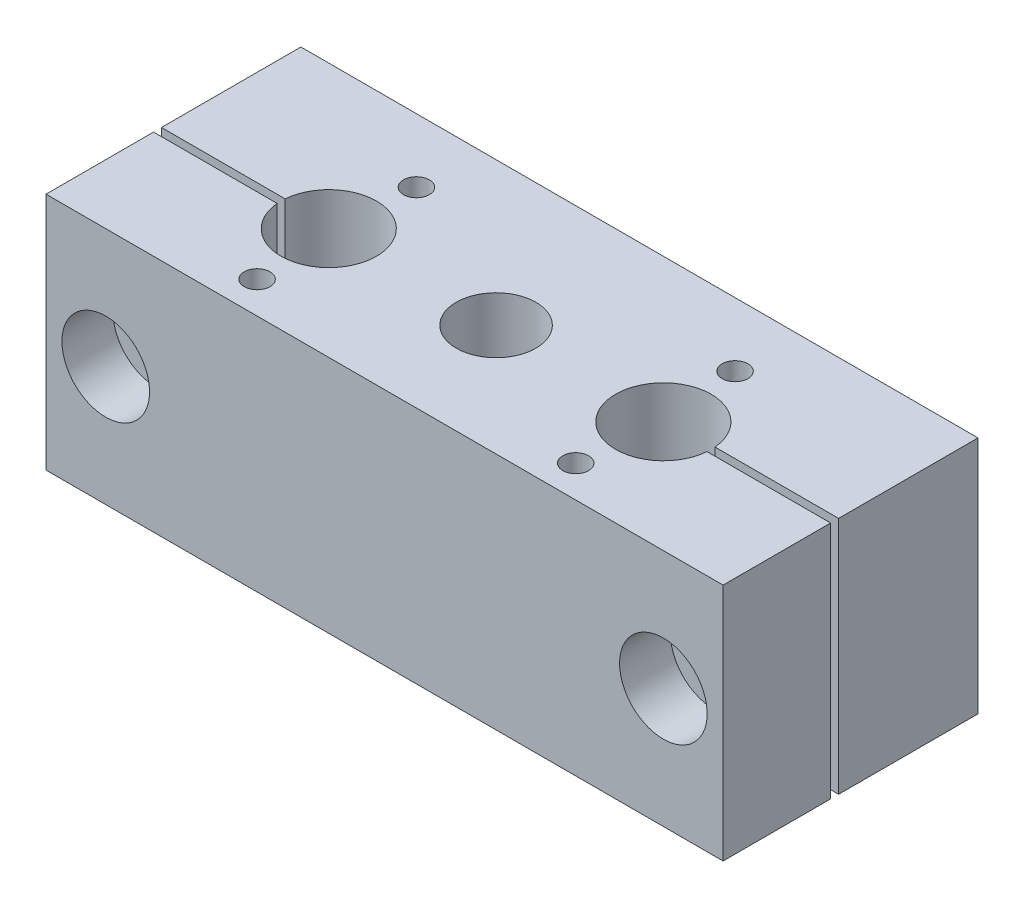
ISO-10303-21;
HEADER;
FILE_DESCRIPTION(('STEP AP214'),'2;1');
FILE_NAME('part.step','',(''),(''),'','','');
FILE_SCHEMA(('AUTOMOTIVE_DESIGN { 1 0 10303 214 1 1 1 1 }'));
ENDSEC;
DATA;
#1=APPLICATION_CONTEXT('core data for automotive mechanical design processes');
#2=APPLICATION_PROTOCOL_DEFINITION('international standard','automotive_design',2000,#1);
#3=PRODUCT_CONTEXT('',#1,'mechanical');
#4=PRODUCT('Part','Part','',(#3));
#5=PRODUCT_RELATED_PRODUCT_CATEGORY('part','',(#4));
#6=PRODUCT_DEFINITION_FORMATION('','',#4);
#7=PRODUCT_DEFINITION_CONTEXT('part definition',#1,'design');
#8=PRODUCT_DEFINITION('design','',#6,#7);
#9=PRODUCT_DEFINITION_SHAPE('','',#8);
#10=(LENGTH_UNIT() NAMED_UNIT(*) SI_UNIT(.MILLI.,.METRE.));
#11=(NAMED_UNIT(*) PLANE_ANGLE_UNIT() SI_UNIT($,.RADIAN.));
#12=(NAMED_UNIT(*) SI_UNIT($,.STERADIAN.) SOLID_ANGLE_UNIT());
#13=UNCERTAINTY_MEASURE_WITH_UNIT(LENGTH_MEASURE(1.E-05),#10,'distance_accuracy_value','');
#14=(GEOMETRIC_REPRESENTATION_CONTEXT(3) GLOBAL_UNCERTAINTY_ASSIGNED_CONTEXT((#13)) GLOBAL_UNIT_ASSIGNED_CONTEXT((#10,
#11,#12)) REPRESENTATION_CONTEXT('',''));
#15=CARTESIAN_POINT('',(0.,0.,0.));
#16=DIRECTION('',(0.,0.,1.));
#17=DIRECTION('',(1.,0.,0.));
#18=AXIS2_PLACEMENT_3D('',#15,#16,#17);
#19=CARTESIAN_POINT('',(-30.6,380.,25.6));
#20=DIRECTION('',(0.,0.,-1.));
#21=DIRECTION('',(-1.,0.,0.));
#22=AXIS2_PLACEMENT_3D('',#19,#20,#21);
#23=PLANE('',#22);
#24=CARTESIAN_POINT('',(-35.,380.,25.6));
#25=DIRECTION('',(0.,0.,-1.));
#26=DIRECTION('',(-1.,0.,0.));
#27=AXIS2_PLACEMENT_3D('',#24,#25,#26);
#28=CIRCLE('',#27,3.3);
#29=CARTESIAN_POINT('',(-38.3,380.,25.6));
#30=VERTEX_POINT('',#29);
#31=EDGE_CURVE('E23',#30,#30,#28,.T.);
#32=ORIENTED_EDGE('',*,*,#31,.T.);
#33=EDGE_LOOP('',(#32));
#34=FACE_BOUND('',#33,.T.);
#35=CARTESIAN_POINT('',(-35.,380.,25.6));
#36=DIRECTION('',(0.,0.,-1.));
#37=DIRECTION('',(-1.,0.,0.));
#38=AXIS2_PLACEMENT_3D('',#35,#36,#37);
#39=CIRCLE('',#38,5.5);
#40=CARTESIAN_POINT('',(-40.5,380.,25.6));
#41=VERTEX_POINT('',#40);
#42=EDGE_CURVE('E418',#41,#41,#39,.F.);
#43=ORIENTED_EDGE('',*,*,#42,.T.);
#44=EDGE_LOOP('',(#43));
#45=FACE_BOUND('',#44,.T.);
#46=ADVANCED_FACE('F19',(#34,#45),#23,.F.);
#47=CARTESIAN_POINT('',(39.4,380.,25.6));
#48=DIRECTION('',(0.,0.,-1.));
#49=DIRECTION('',(-1.,0.,0.));
#50=AXIS2_PLACEMENT_3D('',#47,#48,#49);
#51=PLANE('',#50);
#52=CARTESIAN_POINT('',(35.,380.,25.6));
#53=DIRECTION('',(0.,0.,-1.));
#54=DIRECTION('',(-1.,0.,0.));
#55=AXIS2_PLACEMENT_3D('',#52,#53,#54);
#56=CIRCLE('',#55,3.3);
#57=CARTESIAN_POINT('',(31.7,380.,25.6));
#58=VERTEX_POINT('',#57);
#59=EDGE_CURVE('E412',#58,#58,#56,.T.);
#60=ORIENTED_EDGE('',*,*,#59,.T.);
#61=EDGE_LOOP('',(#60));
#62=FACE_BOUND('',#61,.T.);
#63=CARTESIAN_POINT('',(35.,380.,25.6));
#64=DIRECTION('',(0.,0.,-1.));
#65=DIRECTION('',(-1.,0.,0.));
#66=AXIS2_PLACEMENT_3D('',#63,#64,#65);
#67=CIRCLE('',#66,5.5);
#68=CARTESIAN_POINT('',(29.5,380.,25.6));
#69=VERTEX_POINT('',#68);
#70=EDGE_CURVE('E421',#69,#69,#67,.F.);
#71=ORIENTED_EDGE('',*,*,#70,.T.);
#72=EDGE_LOOP('',(#71));
#73=FACE_BOUND('',#72,.T.);
#74=ADVANCED_FACE('F678',(#62,#73),#51,.F.);
#75=CARTESIAN_POINT('',(20.,379.999999999995,28.));
#76=DIRECTION('',(0.,1.,0.));
#77=DIRECTION('',(0.,0.,1.));
#78=AXIS2_PLACEMENT_3D('',#75,#76,#77);
#79=CONICAL_SURFACE('',#78,1.61999999998443,1.04719755119735);
#80=CARTESIAN_POINT('',(20.,380.,28.));
#81=DIRECTION('',(0.,-1.,0.));
#82=DIRECTION('',(0.,0.,-1.));
#83=AXIS2_PLACEMENT_3D('',#80,#81,#82);
#84=CIRCLE('',#83,1.62);
#85=CARTESIAN_POINT('',(20.,380.,26.38));
#86=VERTEX_POINT('',#85);
#87=EDGE_CURVE('E531',#86,#86,#84,.F.);
#88=ORIENTED_EDGE('',*,*,#87,.T.);
#89=EDGE_LOOP('',(#88));
#90=FACE_BOUND('',#89,.T.);
#91=CARTESIAN_POINT('',(20.0000000000102,379.064692563929,28.));
#92=VERTEX_POINT('',#91);
#93=VERTEX_LOOP('',#92);
#94=FACE_BOUND('',#93,.T.);
#95=ADVANCED_FACE('F677',(#90,#94),#79,.F.);
#96=CARTESIAN_POINT('',(20.,379.999999999995,8.));
#97=DIRECTION('',(0.,1.,0.));
#98=DIRECTION('',(0.,0.,1.));
#99=AXIS2_PLACEMENT_3D('',#96,#97,#98);
#100=CONICAL_SURFACE('',#99,1.61999999998443,1.04719755119735);
#101=CARTESIAN_POINT('',(20.,380.,8.));
#102=DIRECTION('',(0.,-1.,0.));
#103=DIRECTION('',(0.,0.,-1.));
#104=AXIS2_PLACEMENT_3D('',#101,#102,#103);
#105=CIRCLE('',#104,1.62);
#106=CARTESIAN_POINT('',(20.,380.,6.38));
#107=VERTEX_POINT('',#106);
#108=EDGE_CURVE('E527',#107,#107,#105,.F.);
#109=ORIENTED_EDGE('',*,*,#108,.T.);
#110=EDGE_LOOP('',(#109));
#111=FACE_BOUND('',#110,.T.);
#112=CARTESIAN_POINT('',(20.0000000000102,379.064692563929,8.));
#113=VERTEX_POINT('',#112);
#114=VERTEX_LOOP('',#113);
#115=FACE_BOUND('',#114,.T.);
#116=ADVANCED_FACE('F674',(#111,#115),#100,.F.);
#117=CARTESIAN_POINT('',(-20.,379.999999999995,28.));
#118=DIRECTION('',(0.,1.,0.));
#119=DIRECTION('',(0.,0.,1.));
#120=AXIS2_PLACEMENT_3D('',#117,#118,#119);
#121=CONICAL_SURFACE('',#120,1.61999999996397,1.04719755119188);
#122=CARTESIAN_POINT('',(-20.,380.,28.));
#123=DIRECTION('',(0.,-1.,0.));
#124=DIRECTION('',(0.,0.,-1.));
#125=AXIS2_PLACEMENT_3D('',#122,#123,#124);
#126=CIRCLE('',#125,1.62);
#127=CARTESIAN_POINT('',(-20.,380.,26.38));
#128=VERTEX_POINT('',#127);
#129=EDGE_CURVE('E523',#128,#128,#126,.F.);
#130=ORIENTED_EDGE('',*,*,#129,.T.);
#131=EDGE_LOOP('',(#130));
#132=FACE_BOUND('',#131,.T.);
#133=CARTESIAN_POINT('',(-20.0000000000102,379.064692563929,28.));
#134=VERTEX_POINT('',#133);
#135=VERTEX_LOOP('',#134);
#136=FACE_BOUND('',#135,.T.);
#137=ADVANCED_FACE('F671',(#132,#136),#121,.F.);
#138=CARTESIAN_POINT('',(-20.,379.999999999995,8.));
#139=DIRECTION('',(0.,1.,0.));
#140=DIRECTION('',(0.,0.,1.));
#141=AXIS2_PLACEMENT_3D('',#138,#139,#140);
#142=CONICAL_SURFACE('',#141,1.61999999996397,1.04719755119188);
#143=CARTESIAN_POINT('',(-20.,380.,8.));
#144=DIRECTION('',(0.,-1.,0.));
#145=DIRECTION('',(0.,0.,-1.));
#146=AXIS2_PLACEMENT_3D('',#143,#144,#145);
#147=CIRCLE('',#146,1.62);
#148=CARTESIAN_POINT('',(-20.,380.,6.38));
#149=VERTEX_POINT('',#148);
#150=EDGE_CURVE('E520',#149,#149,#147,.F.);
#151=ORIENTED_EDGE('',*,*,#150,.T.);
#152=EDGE_LOOP('',(#151));
#153=FACE_BOUND('',#152,.T.);
#154=CARTESIAN_POINT('',(-20.0000000000102,379.064692563929,8.));
#155=VERTEX_POINT('',#154);
#156=VERTEX_LOOP('',#155);
#157=FACE_BOUND('',#156,.T.);
#158=ADVANCED_FACE('F668',(#153,#157),#142,.F.);
#159=CARTESIAN_POINT('',(-35.,380.,17.5000000000409));
#160=DIRECTION('',(0.,0.,1.));
#161=DIRECTION('',(1.,0.,0.));
#162=AXIS2_PLACEMENT_3D('',#159,#160,#161);
#163=CONICAL_SURFACE('',#162,4.00000000004411,0.785398163397448);
#164=CARTESIAN_POINT('',(-35.,380.,16.9));
#165=DIRECTION('',(0.,0.,1.));
#166=DIRECTION('',(1.,0.,0.));
#167=AXIS2_PLACEMENT_3D('',#164,#165,#166);
#168=CIRCLE('',#167,3.4);
#169=CARTESIAN_POINT('',(-31.6,380.,16.9));
#170=VERTEX_POINT('',#169);
#171=EDGE_CURVE('E534',#170,#170,#168,.F.);
#172=ORIENTED_EDGE('',*,*,#171,.T.);
#173=EDGE_LOOP('',(#172));
#174=FACE_BOUND('',#173,.T.);
#175=CARTESIAN_POINT('',(-35.,380.,17.5000000000409));
#176=DIRECTION('',(0.,0.,1.));
#177=DIRECTION('',(1.,0.,0.));
#178=AXIS2_PLACEMENT_3D('',#175,#176,#177);
#179=CIRCLE('',#178,4.00000000004411);
#180=CARTESIAN_POINT('',(-30.9999999999559,380.,17.5000000000409));
#181=VERTEX_POINT('',#180);
#182=EDGE_CURVE('E212',#181,#181,#179,.F.);
#183=ORIENTED_EDGE('',*,*,#182,.F.);
#184=EDGE_LOOP('',(#183));
#185=FACE_BOUND('',#184,.T.);
#186=ADVANCED_FACE('F437',(#174,#185),#163,.F.);
#187=CARTESIAN_POINT('',(-35.,380.,21.55));
#188=DIRECTION('',(0.,0.,-1.));
#189=DIRECTION('',(-1.,0.,0.));
#190=AXIS2_PLACEMENT_3D('',#187,#188,#189);
#191=CYLINDRICAL_SURFACE('',#190,3.3);
#192=ORIENTED_EDGE('',*,*,#31,.F.);
#193=EDGE_LOOP('',(#192));
#194=FACE_BOUND('',#193,.T.);
#195=CARTESIAN_POINT('',(-35.,380.,18.5));
#196=DIRECTION('',(0.,0.,-1.));
#197=DIRECTION('',(-1.,0.,0.));
#198=AXIS2_PLACEMENT_3D('',#195,#196,#197);
#199=CIRCLE('',#198,3.3);
#200=CARTESIAN_POINT('',(-38.3,380.,18.5));
#201=VERTEX_POINT('',#200);
#202=EDGE_CURVE('E177',#201,#201,#199,.T.);
#203=ORIENTED_EDGE('',*,*,#202,.T.);
#204=EDGE_LOOP('',(#203));
#205=FACE_BOUND('',#204,.T.);
#206=ADVANCED_FACE('F433',(#194,#205),#191,.F.);
#207=CARTESIAN_POINT('',(35.,380.,28.8));
#208=DIRECTION('',(0.,0.,-1.));
#209=DIRECTION('',(-1.,0.,0.));
#210=AXIS2_PLACEMENT_3D('',#207,#208,#209);
#211=CYLINDRICAL_SURFACE('',#210,5.5);
#212=CARTESIAN_POINT('',(35.,380.,32.));
#213=DIRECTION('',(0.,0.,-1.));
#214=DIRECTION('',(-1.,0.,0.));
#215=AXIS2_PLACEMENT_3D('',#212,#213,#214);
#216=CIRCLE('',#215,5.5);
#217=CARTESIAN_POINT('',(29.5,380.,32.));
#218=VERTEX_POINT('',#217);
#219=EDGE_CURVE('E330',#218,#218,#216,.T.);
#220=ORIENTED_EDGE('',*,*,#219,.F.);
#221=EDGE_LOOP('',(#220));
#222=FACE_BOUND('',#221,.T.);
#223=ORIENTED_EDGE('',*,*,#70,.F.);
#224=EDGE_LOOP('',(#223));
#225=FACE_BOUND('',#224,.T.);
#226=ADVANCED_FACE('F436',(#222,#225),#211,.F.);
#227=CARTESIAN_POINT('',(-35.,380.,28.8));
#228=DIRECTION('',(0.,0.,-1.));
#229=DIRECTION('',(-1.,0.,0.));
#230=AXIS2_PLACEMENT_3D('',#227,#228,#229);
#231=CYLINDRICAL_SURFACE('',#230,5.5);
#232=CARTESIAN_POINT('',(-35.,380.,32.));
#233=DIRECTION('',(0.,0.,-1.));
#234=DIRECTION('',(-1.,0.,0.));
#235=AXIS2_PLACEMENT_3D('',#232,#233,#234);
#236=CIRCLE('',#235,5.5);
#237=CARTESIAN_POINT('',(-40.5,380.,32.));
#238=VERTEX_POINT('',#237);
#239=EDGE_CURVE('E321',#238,#238,#236,.T.);
#240=ORIENTED_EDGE('',*,*,#239,.F.);
#241=EDGE_LOOP('',(#240));
#242=FACE_BOUND('',#241,.T.);
#243=ORIENTED_EDGE('',*,*,#42,.F.);
#244=EDGE_LOOP('',(#243));
#245=FACE_BOUND('',#244,.T.);
#246=ADVANCED_FACE('F662',(#242,#245),#231,.F.);
#247=CARTESIAN_POINT('',(35.,380.,21.55));
#248=DIRECTION('',(0.,0.,-1.));
#249=DIRECTION('',(-1.,0.,0.));
#250=AXIS2_PLACEMENT_3D('',#247,#248,#249);
#251=CYLINDRICAL_SURFACE('',#250,3.3);
#252=ORIENTED_EDGE('',*,*,#59,.F.);
#253=EDGE_LOOP('',(#252));
#254=FACE_BOUND('',#253,.T.);
#255=CARTESIAN_POINT('',(35.,380.,18.5));
#256=DIRECTION('',(0.,0.,-1.));
#257=DIRECTION('',(-1.,0.,0.));
#258=AXIS2_PLACEMENT_3D('',#255,#256,#257);
#259=CIRCLE('',#258,3.3);
#260=CARTESIAN_POINT('',(31.7,380.,18.5));
#261=VERTEX_POINT('',#260);
#262=EDGE_CURVE('E308',#261,#261,#259,.T.);
#263=ORIENTED_EDGE('',*,*,#262,.T.);
#264=EDGE_LOOP('',(#263));
#265=FACE_BOUND('',#264,.T.);
#266=ADVANCED_FACE('F567',(#254,#265),#251,.F.);
#267=CARTESIAN_POINT('',(35.,380.,17.4999999999272));
#268=DIRECTION('',(0.,0.,1.));
#269=DIRECTION('',(1.,0.,0.));
#270=AXIS2_PLACEMENT_3D('',#267,#268,#269);
#271=CONICAL_SURFACE('',#270,3.99999999999409,0.785398163444818);
#272=CARTESIAN_POINT('',(35.,380.,16.9));
#273=DIRECTION('',(0.,0.,1.));
#274=DIRECTION('',(1.,0.,0.));
#275=AXIS2_PLACEMENT_3D('',#272,#273,#274);
#276=CIRCLE('',#275,3.4);
#277=CARTESIAN_POINT('',(38.4,380.,16.9));
#278=VERTEX_POINT('',#277);
#279=EDGE_CURVE('E417',#278,#278,#276,.F.);
#280=ORIENTED_EDGE('',*,*,#279,.T.);
#281=EDGE_LOOP('',(#280));
#282=FACE_BOUND('',#281,.T.);
#283=CARTESIAN_POINT('',(35.,380.,17.4999999999522));
#284=DIRECTION('',(0.,0.,1.));
#285=DIRECTION('',(1.,0.,0.));
#286=AXIS2_PLACEMENT_3D('',#283,#284,#285);
#287=CIRCLE('',#286,4.0000000000191);
#288=CARTESIAN_POINT('',(39.0000000000191,380.,17.4999999999522));
#289=VERTEX_POINT('',#288);
#290=EDGE_CURVE('E358',#289,#289,#287,.F.);
#291=ORIENTED_EDGE('',*,*,#290,.F.);
#292=EDGE_LOOP('',(#291));
#293=FACE_BOUND('',#292,.T.);
#294=ADVANCED_FACE('F551',(#282,#293),#271,.F.);
#295=CARTESIAN_POINT('',(35.,380.,8.75));
#296=DIRECTION('',(0.,0.,1.));
#297=DIRECTION('',(1.,0.,0.));
#298=AXIS2_PLACEMENT_3D('',#295,#296,#297);
#299=CYLINDRICAL_SURFACE('',#298,3.4);
#300=CARTESIAN_POINT('',(35.,380.,0.600000000076761));
#301=DIRECTION('',(0.,0.,-1.));
#302=DIRECTION('',(-1.,0.,0.));
#303=AXIS2_PLACEMENT_3D('',#300,#301,#302);
#304=CIRCLE('',#303,3.39999999997417);
#305=CARTESIAN_POINT('',(31.6000000000258,380.,0.600000000076761));
#306=VERTEX_POINT('',#305);
#307=EDGE_CURVE('E481',#306,#306,#304,.T.);
#308=ORIENTED_EDGE('',*,*,#307,.T.);
#309=EDGE_LOOP('',(#308));
#310=FACE_BOUND('',#309,.T.);
#311=ORIENTED_EDGE('',*,*,#279,.F.);
#312=EDGE_LOOP('',(#311));
#313=FACE_BOUND('',#312,.T.);
#314=ADVANCED_FACE('F554',(#310,#313),#299,.F.);
#315=CARTESIAN_POINT('',(-35.,380.,8.75));
#316=DIRECTION('',(0.,0.,1.));
#317=DIRECTION('',(1.,0.,0.));
#318=AXIS2_PLACEMENT_3D('',#315,#316,#317);
#319=CYLINDRICAL_SURFACE('',#318,3.4);
#320=CARTESIAN_POINT('',(-35.,380.,0.599999999963075));
#321=DIRECTION('',(0.,0.,-1.));
#322=DIRECTION('',(-1.,0.,0.));
#323=AXIS2_PLACEMENT_3D('',#320,#321,#322);
#324=CIRCLE('',#323,3.40000000002419);
#325=CARTESIAN_POINT('',(-38.4000000000242,380.,0.599999999963075));
#326=VERTEX_POINT('',#325);
#327=EDGE_CURVE('E368',#326,#326,#324,.T.);
#328=ORIENTED_EDGE('',*,*,#327,.T.);
#329=EDGE_LOOP('',(#328));
#330=FACE_BOUND('',#329,.T.);
#331=ORIENTED_EDGE('',*,*,#171,.F.);
#332=EDGE_LOOP('',(#331));
#333=FACE_BOUND('',#332,.T.);
#334=ADVANCED_FACE('F556',(#330,#333),#319,.F.);
#335=CARTESIAN_POINT('',(20.,387.5,28.));
#336=DIRECTION('',(0.,-1.,0.));
#337=DIRECTION('',(0.,0.,-1.));
#338=AXIS2_PLACEMENT_3D('',#335,#336,#337);
#339=CYLINDRICAL_SURFACE('',#338,1.62);
#340=ORIENTED_EDGE('',*,*,#87,.F.);
#341=EDGE_LOOP('',(#340));
#342=FACE_BOUND('',#341,.T.);
#343=CARTESIAN_POINT('',(20.,395.,28.));
#344=DIRECTION('',(0.,-1.,0.));
#345=DIRECTION('',(0.,0.,-1.));
#346=AXIS2_PLACEMENT_3D('',#343,#344,#345);
#347=CIRCLE('',#346,1.62);
#348=CARTESIAN_POINT('',(20.,395.,26.38));
#349=VERTEX_POINT('',#348);
#350=EDGE_CURVE('E363',#349,#349,#347,.F.);
#351=ORIENTED_EDGE('',*,*,#350,.T.);
#352=EDGE_LOOP('',(#351));
#353=FACE_BOUND('',#352,.T.);
#354=ADVANCED_FACE('F564',(#342,#353),#339,.F.);
#355=CARTESIAN_POINT('',(20.,387.5,8.));
#356=DIRECTION('',(0.,-1.,0.));
#357=DIRECTION('',(0.,0.,-1.));
#358=AXIS2_PLACEMENT_3D('',#355,#356,#357);
#359=CYLINDRICAL_SURFACE('',#358,1.62);
#360=ORIENTED_EDGE('',*,*,#108,.F.);
#361=EDGE_LOOP('',(#360));
#362=FACE_BOUND('',#361,.T.);
#363=CARTESIAN_POINT('',(20.,395.,8.));
#364=DIRECTION('',(0.,-1.,0.));
#365=DIRECTION('',(0.,0.,-1.));
#366=AXIS2_PLACEMENT_3D('',#363,#364,#365);
#367=CIRCLE('',#366,1.62);
#368=CARTESIAN_POINT('',(20.,395.,6.38));
#369=VERTEX_POINT('',#368);
#370=EDGE_CURVE('E367',#369,#369,#367,.F.);
#371=ORIENTED_EDGE('',*,*,#370,.T.);
#372=EDGE_LOOP('',(#371));
#373=FACE_BOUND('',#372,.T.);
#374=ADVANCED_FACE('F642',(#362,#373),#359,.F.);
#375=CARTESIAN_POINT('',(-20.,387.5,28.));
#376=DIRECTION('',(0.,-1.,0.));
#377=DIRECTION('',(0.,0.,-1.));
#378=AXIS2_PLACEMENT_3D('',#375,#376,#377);
#379=CYLINDRICAL_SURFACE('',#378,1.62);
#380=ORIENTED_EDGE('',*,*,#129,.F.);
#381=EDGE_LOOP('',(#380));
#382=FACE_BOUND('',#381,.T.);
#383=CARTESIAN_POINT('',(-20.,395.,28.));
#384=DIRECTION('',(0.,-1.,0.));
#385=DIRECTION('',(0.,0.,-1.));
#386=AXIS2_PLACEMENT_3D('',#383,#384,#385);
#387=CIRCLE('',#386,1.62);
#388=CARTESIAN_POINT('',(-20.,395.,26.38));
#389=VERTEX_POINT('',#388);
#390=EDGE_CURVE('E372',#389,#389,#387,.F.);
#391=ORIENTED_EDGE('',*,*,#390,.T.);
#392=EDGE_LOOP('',(#391));
#393=FACE_BOUND('',#392,.T.);
#394=ADVANCED_FACE('F637',(#382,#393),#379,.F.);
#395=CARTESIAN_POINT('',(-20.,387.5,8.));
#396=DIRECTION('',(0.,-1.,0.));
#397=DIRECTION('',(0.,0.,-1.));
#398=AXIS2_PLACEMENT_3D('',#395,#396,#397);
#399=CYLINDRICAL_SURFACE('',#398,1.62);
#400=ORIENTED_EDGE('',*,*,#150,.F.);
#401=EDGE_LOOP('',(#400));
#402=FACE_BOUND('',#401,.T.);
#403=CARTESIAN_POINT('',(-20.,395.,8.));
#404=DIRECTION('',(0.,-1.,0.));
#405=DIRECTION('',(0.,0.,-1.));
#406=AXIS2_PLACEMENT_3D('',#403,#404,#405);
#407=CIRCLE('',#406,1.62);
#408=CARTESIAN_POINT('',(-20.,395.,6.38));
#409=VERTEX_POINT('',#408);
#410=EDGE_CURVE('E376',#409,#409,#407,.F.);
#411=ORIENTED_EDGE('',*,*,#410,.T.);
#412=EDGE_LOOP('',(#411));
#413=FACE_BOUND('',#412,.T.);
#414=ADVANCED_FACE('F632',(#402,#413),#399,.F.);
#415=CARTESIAN_POINT('',(0.,380.,18.));
#416=DIRECTION('',(0.,1.,0.));
#417=DIRECTION('',(0.,0.,1.));
#418=AXIS2_PLACEMENT_3D('',#415,#416,#417);
#419=CYLINDRICAL_SURFACE('',#418,5.);
#420=CARTESIAN_POINT('',(0.,395.,18.));
#421=DIRECTION('',(0.,1.,0.));
#422=DIRECTION('',(0.,0.,1.));
#423=AXIS2_PLACEMENT_3D('',#420,#421,#422);
#424=CIRCLE('',#423,5.);
#425=CARTESIAN_POINT('',(0.,395.,23.));
#426=VERTEX_POINT('',#425);
#427=EDGE_CURVE('E274',#426,#426,#424,.T.);
#428=ORIENTED_EDGE('',*,*,#427,.T.);
#429=EDGE_LOOP('',(#428));
#430=FACE_BOUND('',#429,.T.);
#431=CARTESIAN_POINT('',(0.,365.,18.));
#432=DIRECTION('',(0.,1.,0.));
#433=DIRECTION('',(0.,0.,1.));
#434=AXIS2_PLACEMENT_3D('',#431,#432,#433);
#435=CIRCLE('',#434,5.);
#436=CARTESIAN_POINT('',(0.,365.,23.));
#437=VERTEX_POINT('',#436);
#438=EDGE_CURVE('E252',#437,#437,#435,.F.);
#439=ORIENTED_EDGE('',*,*,#438,.T.);
#440=EDGE_LOOP('',(#439));
#441=FACE_BOUND('',#440,.T.);
#442=ADVANCED_FACE('F628',(#430,#441),#419,.F.);
#443=CARTESIAN_POINT('',(21.,380.,18.));
#444=DIRECTION('',(0.,-1.,0.));
#445=DIRECTION('',(0.,0.,-1.));
#446=AXIS2_PLACEMENT_3D('',#443,#444,#445);
#447=CYLINDRICAL_SURFACE('',#446,6.);
#448=CARTESIAN_POINT('',(21.,365.,18.));
#449=DIRECTION('',(0.,-1.,0.));
#450=DIRECTION('',(0.,0.,-1.));
#451=AXIS2_PLACEMENT_3D('',#448,#449,#450);
#452=CIRCLE('',#451,6.);
#453=CARTESIAN_POINT('',(26.9791303715507,365.,18.5));
#454=VERTEX_POINT('',#453);
#455=CARTESIAN_POINT('',(26.9791303715507,365.,17.5));
#456=VERTEX_POINT('',#455);
#457=EDGE_CURVE('E389',#454,#456,#452,.T.);
#458=ORIENTED_EDGE('',*,*,#457,.T.);
#459=DIRECTION('',(0.,1.,0.));
#460=VECTOR('',#459,1.);
#461=CARTESIAN_POINT('',(26.9791303715507,380.,17.5));
#462=LINE('',#461,#460);
#463=CARTESIAN_POINT('',(26.9791303715507,395.,17.5));
#464=VERTEX_POINT('',#463);
#465=EDGE_CURVE('E362',#464,#456,#462,.F.);
#466=ORIENTED_EDGE('',*,*,#465,.F.);
#467=CARTESIAN_POINT('',(21.,395.,18.));
#468=DIRECTION('',(0.,-1.,0.));
#469=DIRECTION('',(0.,0.,-1.));
#470=AXIS2_PLACEMENT_3D('',#467,#468,#469);
#471=CIRCLE('',#470,6.);
#472=CARTESIAN_POINT('',(26.9791303715507,395.,18.5));
#473=VERTEX_POINT('',#472);
#474=EDGE_CURVE('E238',#464,#473,#471,.F.);
#475=ORIENTED_EDGE('',*,*,#474,.T.);
#476=DIRECTION('',(0.,1.,0.));
#477=VECTOR('',#476,1.);
#478=CARTESIAN_POINT('',(26.9791303715507,380.,18.5));
#479=LINE('',#478,#477);
#480=EDGE_CURVE('E195',#473,#454,#479,.F.);
#481=ORIENTED_EDGE('',*,*,#480,.T.);
#482=EDGE_LOOP('',(#458,#466,#475,#481));
#483=FACE_BOUND('',#482,.T.);
#484=ADVANCED_FACE('F517',(#483),#447,.F.);
#485=CARTESIAN_POINT('',(-31.875,380.,17.5));
#486=DIRECTION('',(0.,0.,1.));
#487=DIRECTION('',(1.,0.,0.));
#488=AXIS2_PLACEMENT_3D('',#485,#486,#487);
#489=PLANE('',#488);
#490=DIRECTION('',(0.,1.,0.));
#491=VECTOR('',#490,1.);
#492=CARTESIAN_POINT('',(-42.5,380.,17.5));
#493=LINE('',#492,#491);
#494=CARTESIAN_POINT('',(-42.5,395.,17.5));
#495=VERTEX_POINT('',#494);
#496=CARTESIAN_POINT('',(-42.5,365.,17.5));
#497=VERTEX_POINT('',#496);
#498=EDGE_CURVE('E221',#495,#497,#493,.F.);
#499=ORIENTED_EDGE('',*,*,#498,.T.);
#500=DIRECTION('',(1.,0.,0.));
#501=VECTOR('',#500,1.);
#502=CARTESIAN_POINT('',(0.,365.,17.5));
#503=LINE('',#502,#501);
#504=CARTESIAN_POINT('',(-26.9791303715507,365.,17.5));
#505=VERTEX_POINT('',#504);
#506=EDGE_CURVE('E217',#497,#505,#503,.T.);
#507=ORIENTED_EDGE('',*,*,#506,.T.);
#508=DIRECTION('',(0.,-1.,0.));
#509=VECTOR('',#508,1.);
#510=CARTESIAN_POINT('',(-26.9791303715507,380.,17.5));
#511=LINE('',#510,#509);
#512=CARTESIAN_POINT('',(-26.9791303715507,395.,17.5));
#513=VERTEX_POINT('',#512);
#514=EDGE_CURVE('E148',#505,#513,#511,.F.);
#515=ORIENTED_EDGE('',*,*,#514,.T.);
#516=DIRECTION('',(1.,0.,0.));
#517=VECTOR('',#516,1.);
#518=CARTESIAN_POINT('',(0.,395.,17.5));
#519=LINE('',#518,#517);
#520=EDGE_CURVE('E164',#513,#495,#519,.F.);
#521=ORIENTED_EDGE('',*,*,#520,.T.);
#522=EDGE_LOOP('',(#499,#507,#515,#521));
#523=FACE_BOUND('',#522,.T.);
#524=ORIENTED_EDGE('',*,*,#182,.T.);
#525=EDGE_LOOP('',(#524));
#526=FACE_BOUND('',#525,.T.);
#527=ADVANCED_FACE('F243',(#523,#526),#489,.T.);
#528=CARTESIAN_POINT('',(-21.,380.,18.));
#529=DIRECTION('',(0.,-1.,0.));
#530=DIRECTION('',(0.,0.,-1.));
#531=AXIS2_PLACEMENT_3D('',#528,#529,#530);
#532=CYLINDRICAL_SURFACE('',#531,6.);
#533=CARTESIAN_POINT('',(-21.,365.,18.));
#534=DIRECTION('',(0.,-1.,0.));
#535=DIRECTION('',(0.,0.,-1.));
#536=AXIS2_PLACEMENT_3D('',#533,#534,#535);
#537=CIRCLE('',#536,6.);
#538=CARTESIAN_POINT('',(-26.9791303715507,365.,18.5));
#539=VERTEX_POINT('',#538);
#540=EDGE_CURVE('E171',#505,#539,#537,.T.);
#541=ORIENTED_EDGE('',*,*,#540,.T.);
#542=DIRECTION('',(0.,1.,0.));
#543=VECTOR('',#542,1.);
#544=CARTESIAN_POINT('',(-26.9791303715507,380.,18.5));
#545=LINE('',#544,#543);
#546=CARTESIAN_POINT('',(-26.9791303715507,395.,18.5));
#547=VERTEX_POINT('',#546);
#548=EDGE_CURVE('E169',#539,#547,#545,.T.);
#549=ORIENTED_EDGE('',*,*,#548,.T.);
#550=CARTESIAN_POINT('',(-21.,395.,18.));
#551=DIRECTION('',(0.,-1.,0.));
#552=DIRECTION('',(0.,0.,-1.));
#553=AXIS2_PLACEMENT_3D('',#550,#551,#552);
#554=CIRCLE('',#553,6.);
#555=EDGE_CURVE('E155',#547,#513,#554,.F.);
#556=ORIENTED_EDGE('',*,*,#555,.T.);
#557=ORIENTED_EDGE('',*,*,#514,.F.);
#558=EDGE_LOOP('',(#541,#549,#556,#557));
#559=FACE_BOUND('',#558,.T.);
#560=ADVANCED_FACE('F170',(#559),#532,.F.);
#561=CARTESIAN_POINT('',(-31.875,380.,18.5));
#562=DIRECTION('',(0.,0.,1.));
#563=DIRECTION('',(1.,0.,0.));
#564=AXIS2_PLACEMENT_3D('',#561,#562,#563);
#565=PLANE('',#564);
#566=DIRECTION('',(1.,0.,0.));
#567=VECTOR('',#566,1.);
#568=CARTESIAN_POINT('',(0.,365.,18.5));
#569=LINE('',#568,#567);
#570=CARTESIAN_POINT('',(-42.5,365.,18.5));
#571=VERTEX_POINT('',#570);
#572=EDGE_CURVE('E327',#539,#571,#569,.F.);
#573=ORIENTED_EDGE('',*,*,#572,.T.);
#574=DIRECTION('',(0.,1.,0.));
#575=VECTOR('',#574,1.);
#576=CARTESIAN_POINT('',(-42.5,380.,18.5));
#577=LINE('',#576,#575);
#578=CARTESIAN_POINT('',(-42.5,395.,18.5));
#579=VERTEX_POINT('',#578);
#580=EDGE_CURVE('E176',#571,#579,#577,.T.);
#581=ORIENTED_EDGE('',*,*,#580,.T.);
#582=DIRECTION('',(1.,0.,0.));
#583=VECTOR('',#582,1.);
#584=CARTESIAN_POINT('',(0.,395.,18.5));
#585=LINE('',#584,#583);
#586=EDGE_CURVE('E161',#579,#547,#585,.T.);
#587=ORIENTED_EDGE('',*,*,#586,.T.);
#588=ORIENTED_EDGE('',*,*,#548,.F.);
#589=EDGE_LOOP('',(#573,#581,#587,#588));
#590=FACE_BOUND('',#589,.T.);
#591=ORIENTED_EDGE('',*,*,#202,.F.);
#592=EDGE_LOOP('',(#591));
#593=FACE_BOUND('',#592,.T.);
#594=ADVANCED_FACE('F179',(#590,#593),#565,.F.);
#595=CARTESIAN_POINT('',(-42.5,380.,16.));
#596=DIRECTION('',(1.,0.,0.));
#597=DIRECTION('',(0.,0.,-1.));
#598=AXIS2_PLACEMENT_3D('',#595,#596,#597);
#599=PLANE('',#598);
#600=DIRECTION('',(0.,0.,1.));
#601=VECTOR('',#600,1.);
#602=CARTESIAN_POINT('',(-42.5,365.,16.));
#603=LINE('',#602,#601);
#604=CARTESIAN_POINT('',(-42.5,365.,32.));
#605=VERTEX_POINT('',#604);
#606=EDGE_CURVE('E324',#571,#605,#603,.T.);
#607=ORIENTED_EDGE('',*,*,#606,.T.);
#608=DIRECTION('',(0.,1.,0.));
#609=VECTOR('',#608,1.);
#610=CARTESIAN_POINT('',(-42.5,380.,32.));
#611=LINE('',#610,#609);
#612=CARTESIAN_POINT('',(-42.5,395.,32.));
#613=VERTEX_POINT('',#612);
#614=EDGE_CURVE('E309',#613,#605,#611,.F.);
#615=ORIENTED_EDGE('',*,*,#614,.F.);
#616=DIRECTION('',(0.,0.,-1.));
#617=VECTOR('',#616,1.);
#618=CARTESIAN_POINT('',(-42.5,395.,16.));
#619=LINE('',#618,#617);
#620=EDGE_CURVE('E182',#613,#579,#619,.T.);
#621=ORIENTED_EDGE('',*,*,#620,.T.);
#622=ORIENTED_EDGE('',*,*,#580,.F.);
#623=EDGE_LOOP('',(#607,#615,#621,#622));
#624=FACE_BOUND('',#623,.T.);
#625=ADVANCED_FACE('F511',(#624),#599,.F.);
#626=CARTESIAN_POINT('',(0.,380.,32.));
#627=DIRECTION('',(0.,0.,1.));
#628=DIRECTION('',(1.,0.,0.));
#629=AXIS2_PLACEMENT_3D('',#626,#627,#628);
#630=PLANE('',#629);
#631=ORIENTED_EDGE('',*,*,#614,.T.);
#632=DIRECTION('',(1.,0.,0.));
#633=VECTOR('',#632,1.);
#634=CARTESIAN_POINT('',(0.,365.,32.));
#635=LINE('',#634,#633);
#636=CARTESIAN_POINT('',(42.5,365.,32.));
#637=VERTEX_POINT('',#636);
#638=EDGE_CURVE('E302',#605,#637,#635,.T.);
#639=ORIENTED_EDGE('',*,*,#638,.T.);
#640=DIRECTION('',(0.,1.,0.));
#641=VECTOR('',#640,1.);
#642=CARTESIAN_POINT('',(42.5,380.,32.));
#643=LINE('',#642,#641);
#644=CARTESIAN_POINT('',(42.5,395.,32.));
#645=VERTEX_POINT('',#644);
#646=EDGE_CURVE('E305',#637,#645,#643,.T.);
#647=ORIENTED_EDGE('',*,*,#646,.T.);
#648=DIRECTION('',(1.,0.,0.));
#649=VECTOR('',#648,1.);
#650=CARTESIAN_POINT('',(0.,395.,32.));
#651=LINE('',#650,#649);
#652=EDGE_CURVE('E187',#645,#613,#651,.F.);
#653=ORIENTED_EDGE('',*,*,#652,.T.);
#654=EDGE_LOOP('',(#631,#639,#647,#653));
#655=FACE_BOUND('',#654,.T.);
#656=ORIENTED_EDGE('',*,*,#239,.T.);
#657=EDGE_LOOP('',(#656));
#658=FACE_BOUND('',#657,.T.);
#659=ORIENTED_EDGE('',*,*,#219,.T.);
#660=EDGE_LOOP('',(#659));
#661=FACE_BOUND('',#660,.T.);
#662=ADVANCED_FACE('F507',(#655,#658,#661),#630,.T.);
#663=CARTESIAN_POINT('',(42.5,380.,16.));
#664=DIRECTION('',(-1.,0.,0.));
#665=DIRECTION('',(0.,0.,1.));
#666=AXIS2_PLACEMENT_3D('',#663,#664,#665);
#667=PLANE('',#666);
#668=DIRECTION('',(0.,0.,-1.));
#669=VECTOR('',#668,1.);
#670=CARTESIAN_POINT('',(42.5,395.,16.));
#671=LINE('',#670,#669);
#672=CARTESIAN_POINT('',(42.5,395.,18.5));
#673=VERTEX_POINT('',#672);
#674=EDGE_CURVE('E270',#673,#645,#671,.F.);
#675=ORIENTED_EDGE('',*,*,#674,.T.);
#676=ORIENTED_EDGE('',*,*,#646,.F.);
#677=DIRECTION('',(0.,0.,1.));
#678=VECTOR('',#677,1.);
#679=CARTESIAN_POINT('',(42.5,365.,16.));
#680=LINE('',#679,#678);
#681=CARTESIAN_POINT('',(42.5,365.,18.5));
#682=VERTEX_POINT('',#681);
#683=EDGE_CURVE('E297',#637,#682,#680,.F.);
#684=ORIENTED_EDGE('',*,*,#683,.T.);
#685=DIRECTION('',(0.,1.,0.));
#686=VECTOR('',#685,1.);
#687=CARTESIAN_POINT('',(42.5,380.,18.5));
#688=LINE('',#687,#686);
#689=EDGE_CURVE('E296',#682,#673,#688,.T.);
#690=ORIENTED_EDGE('',*,*,#689,.T.);
#691=EDGE_LOOP('',(#675,#676,#684,#690));
#692=FACE_BOUND('',#691,.T.);
#693=ADVANCED_FACE('F503',(#692),#667,.F.);
#694=CARTESIAN_POINT('',(31.875,380.,18.5));
#695=DIRECTION('',(0.,0.,1.));
#696=DIRECTION('',(1.,0.,0.));
#697=AXIS2_PLACEMENT_3D('',#694,#695,#696);
#698=PLANE('',#697);
#699=DIRECTION('',(1.,0.,0.));
#700=VECTOR('',#699,1.);
#701=CARTESIAN_POINT('',(0.,395.,18.5));
#702=LINE('',#701,#700);
#703=EDGE_CURVE('E232',#473,#673,#702,.T.);
#704=ORIENTED_EDGE('',*,*,#703,.T.);
#705=ORIENTED_EDGE('',*,*,#689,.F.);
#706=DIRECTION('',(1.,0.,0.));
#707=VECTOR('',#706,1.);
#708=CARTESIAN_POINT('',(0.,365.,18.5));
#709=LINE('',#708,#707);
#710=EDGE_CURVE('E280',#682,#454,#709,.F.);
#711=ORIENTED_EDGE('',*,*,#710,.T.);
#712=ORIENTED_EDGE('',*,*,#480,.F.);
#713=EDGE_LOOP('',(#704,#705,#711,#712));
#714=FACE_BOUND('',#713,.T.);
#715=ORIENTED_EDGE('',*,*,#262,.F.);
#716=EDGE_LOOP('',(#715));
#717=FACE_BOUND('',#716,.T.);
#718=ADVANCED_FACE('F495',(#714,#717),#698,.F.);
#719=CARTESIAN_POINT('',(31.875,380.,17.5));
#720=DIRECTION('',(0.,0.,1.));
#721=DIRECTION('',(1.,0.,0.));
#722=AXIS2_PLACEMENT_3D('',#719,#720,#721);
#723=PLANE('',#722);
#724=DIRECTION('',(0.,1.,0.));
#725=VECTOR('',#724,1.);
#726=CARTESIAN_POINT('',(42.5,380.,17.5));
#727=LINE('',#726,#725);
#728=CARTESIAN_POINT('',(42.5,365.,17.5));
#729=VERTEX_POINT('',#728);
#730=CARTESIAN_POINT('',(42.5,395.,17.5));
#731=VERTEX_POINT('',#730);
#732=EDGE_CURVE('E401',#729,#731,#727,.T.);
#733=ORIENTED_EDGE('',*,*,#732,.T.);
#734=DIRECTION('',(1.,0.,0.));
#735=VECTOR('',#734,1.);
#736=CARTESIAN_POINT('',(0.,395.,17.5));
#737=LINE('',#736,#735);
#738=EDGE_CURVE('E233',#731,#464,#737,.F.);
#739=ORIENTED_EDGE('',*,*,#738,.T.);
#740=ORIENTED_EDGE('',*,*,#465,.T.);
#741=DIRECTION('',(1.,0.,0.));
#742=VECTOR('',#741,1.);
#743=CARTESIAN_POINT('',(0.,365.,17.5));
#744=LINE('',#743,#742);
#745=EDGE_CURVE('E218',#456,#729,#744,.T.);
#746=ORIENTED_EDGE('',*,*,#745,.T.);
#747=EDGE_LOOP('',(#733,#739,#740,#746));
#748=FACE_BOUND('',#747,.T.);
#749=ORIENTED_EDGE('',*,*,#290,.T.);
#750=EDGE_LOOP('',(#749));
#751=FACE_BOUND('',#750,.T.);
#752=ADVANCED_FACE('F462',(#748,#751),#723,.T.);
#753=CARTESIAN_POINT('',(35.,380.,5.6843418860808E-11));
#754=DIRECTION('',(0.,0.,-1.));
#755=DIRECTION('',(-1.,0.,0.));
#756=AXIS2_PLACEMENT_3D('',#753,#754,#755);
#757=CONICAL_SURFACE('',#756,3.99999999999409,0.785398163397448);
#758=CARTESIAN_POINT('',(35.,380.,5.6843418860808E-11));
#759=DIRECTION('',(0.,0.,-1.));
#760=DIRECTION('',(-1.,0.,0.));
#761=AXIS2_PLACEMENT_3D('',#758,#759,#760);
#762=CIRCLE('',#761,3.99999999999409);
#763=CARTESIAN_POINT('',(31.0000000000059,380.,5.6843418860808E-11));
#764=VERTEX_POINT('',#763);
#765=EDGE_CURVE('E396',#764,#764,#762,.T.);
#766=ORIENTED_EDGE('',*,*,#765,.T.);
#767=EDGE_LOOP('',(#766));
#768=FACE_BOUND('',#767,.T.);
#769=ORIENTED_EDGE('',*,*,#307,.F.);
#770=EDGE_LOOP('',(#769));
#771=FACE_BOUND('',#770,.T.);
#772=ADVANCED_FACE('F596',(#768,#771),#757,.F.);
#773=CARTESIAN_POINT('',(-35.,380.,5.6843418860808E-11));
#774=DIRECTION('',(0.,0.,-1.));
#775=DIRECTION('',(-1.,0.,0.));
#776=AXIS2_PLACEMENT_3D('',#773,#774,#775);
#777=CONICAL_SURFACE('',#776,3.99999999998726,0.785398163444818);
#778=CARTESIAN_POINT('',(-35.,380.,8.18511924881205E-11));
#779=DIRECTION('',(0.,0.,-1.));
#780=DIRECTION('',(-1.,0.,0.));
#781=AXIS2_PLACEMENT_3D('',#778,#779,#780);
#782=CIRCLE('',#781,3.99999999996226);
#783=CARTESIAN_POINT('',(-38.9999999999623,380.,8.18511924881205E-11));
#784=VERTEX_POINT('',#783);
#785=EDGE_CURVE('E267',#784,#784,#782,.T.);
#786=ORIENTED_EDGE('',*,*,#785,.T.);
#787=EDGE_LOOP('',(#786));
#788=FACE_BOUND('',#787,.T.);
#789=ORIENTED_EDGE('',*,*,#327,.F.);
#790=EDGE_LOOP('',(#789));
#791=FACE_BOUND('',#790,.T.);
#792=ADVANCED_FACE('F592',(#788,#791),#777,.F.);
#793=CARTESIAN_POINT('',(0.,395.,16.));
#794=DIRECTION('',(0.,-1.,0.));
#795=DIRECTION('',(0.,0.,-1.));
#796=AXIS2_PLACEMENT_3D('',#793,#794,#795);
#797=PLANE('',#796);
#798=ORIENTED_EDGE('',*,*,#474,.F.);
#799=ORIENTED_EDGE('',*,*,#738,.F.);
#800=DIRECTION('',(0.,0.,1.));
#801=VECTOR('',#800,1.);
#802=CARTESIAN_POINT('',(42.5,395.,16.));
#803=LINE('',#802,#801);
#804=CARTESIAN_POINT('',(42.5,395.,0.));
#805=VERTEX_POINT('',#804);
#806=EDGE_CURVE('E277',#731,#805,#803,.F.);
#807=ORIENTED_EDGE('',*,*,#806,.T.);
#808=DIRECTION('',(1.,0.,0.));
#809=VECTOR('',#808,1.);
#810=CARTESIAN_POINT('',(0.,395.,0.));
#811=LINE('',#810,#809);
#812=CARTESIAN_POINT('',(-42.5,395.,0.));
#813=VERTEX_POINT('',#812);
#814=EDGE_CURVE('E255',#805,#813,#811,.F.);
#815=ORIENTED_EDGE('',*,*,#814,.T.);
#816=DIRECTION('',(0.,0.,-1.));
#817=VECTOR('',#816,1.);
#818=CARTESIAN_POINT('',(-42.5,395.,16.));
#819=LINE('',#818,#817);
#820=EDGE_CURVE('E249',#813,#495,#819,.F.);
#821=ORIENTED_EDGE('',*,*,#820,.T.);
#822=ORIENTED_EDGE('',*,*,#520,.F.);
#823=ORIENTED_EDGE('',*,*,#555,.F.);
#824=ORIENTED_EDGE('',*,*,#586,.F.);
#825=ORIENTED_EDGE('',*,*,#620,.F.);
#826=ORIENTED_EDGE('',*,*,#652,.F.);
#827=ORIENTED_EDGE('',*,*,#674,.F.);
#828=ORIENTED_EDGE('',*,*,#703,.F.);
#829=EDGE_LOOP('',(#798,#799,#807,#815,#821,#822,#823,#824,#825,#826,#827,#828));
#830=FACE_BOUND('',#829,.T.);
#831=ORIENTED_EDGE('',*,*,#427,.F.);
#832=EDGE_LOOP('',(#831));
#833=FACE_BOUND('',#832,.T.);
#834=ORIENTED_EDGE('',*,*,#410,.F.);
#835=EDGE_LOOP('',(#834));
#836=FACE_BOUND('',#835,.T.);
#837=ORIENTED_EDGE('',*,*,#390,.F.);
#838=EDGE_LOOP('',(#837));
#839=FACE_BOUND('',#838,.T.);
#840=ORIENTED_EDGE('',*,*,#370,.F.);
#841=EDGE_LOOP('',(#840));
#842=FACE_BOUND('',#841,.T.);
#843=ORIENTED_EDGE('',*,*,#350,.F.);
#844=EDGE_LOOP('',(#843));
#845=FACE_BOUND('',#844,.T.);
#846=ADVANCED_FACE('F157',(#830,#833,#836,#839,#842,#845),#797,.F.);
#847=CARTESIAN_POINT('',(-42.5,380.,16.));
#848=DIRECTION('',(1.,0.,0.));
#849=DIRECTION('',(0.,0.,-1.));
#850=AXIS2_PLACEMENT_3D('',#847,#848,#849);
#851=PLANE('',#850);
#852=ORIENTED_EDGE('',*,*,#820,.F.);
#853=DIRECTION('',(0.,1.,0.));
#854=VECTOR('',#853,1.);
#855=CARTESIAN_POINT('',(-42.5,380.,0.));
#856=LINE('',#855,#854);
#857=CARTESIAN_POINT('',(-42.5,365.,0.));
#858=VERTEX_POINT('',#857);
#859=EDGE_CURVE('E266',#813,#858,#856,.F.);
#860=ORIENTED_EDGE('',*,*,#859,.T.);
#861=DIRECTION('',(0.,0.,1.));
#862=VECTOR('',#861,1.);
#863=CARTESIAN_POINT('',(-42.5,365.,16.));
#864=LINE('',#863,#862);
#865=EDGE_CURVE('E213',#858,#497,#864,.T.);
#866=ORIENTED_EDGE('',*,*,#865,.T.);
#867=ORIENTED_EDGE('',*,*,#498,.F.);
#868=EDGE_LOOP('',(#852,#860,#866,#867));
#869=FACE_BOUND('',#868,.T.);
#870=ADVANCED_FACE('F247',(#869),#851,.F.);
#871=CARTESIAN_POINT('',(0.,365.,16.));
#872=DIRECTION('',(0.,1.,0.));
#873=DIRECTION('',(0.,0.,1.));
#874=AXIS2_PLACEMENT_3D('',#871,#872,#873);
#875=PLANE('',#874);
#876=ORIENTED_EDGE('',*,*,#683,.F.);
#877=ORIENTED_EDGE('',*,*,#638,.F.);
#878=ORIENTED_EDGE('',*,*,#606,.F.);
#879=ORIENTED_EDGE('',*,*,#572,.F.);
#880=ORIENTED_EDGE('',*,*,#540,.F.);
#881=ORIENTED_EDGE('',*,*,#506,.F.);
#882=ORIENTED_EDGE('',*,*,#865,.F.);
#883=DIRECTION('',(1.,0.,0.));
#884=VECTOR('',#883,1.);
#885=CARTESIAN_POINT('',(0.,365.,0.));
#886=LINE('',#885,#884);
#887=CARTESIAN_POINT('',(42.5,365.,0.));
#888=VERTEX_POINT('',#887);
#889=EDGE_CURVE('E31',#858,#888,#886,.T.);
#890=ORIENTED_EDGE('',*,*,#889,.T.);
#891=DIRECTION('',(0.,0.,1.));
#892=VECTOR('',#891,1.);
#893=CARTESIAN_POINT('',(42.5,365.,16.));
#894=LINE('',#893,#892);
#895=EDGE_CURVE('E43',#888,#729,#894,.T.);
#896=ORIENTED_EDGE('',*,*,#895,.T.);
#897=ORIENTED_EDGE('',*,*,#745,.F.);
#898=ORIENTED_EDGE('',*,*,#457,.F.);
#899=ORIENTED_EDGE('',*,*,#710,.F.);
#900=EDGE_LOOP('',(#876,#877,#878,#879,#880,#881,#882,#890,#896,#897,#898,#899));
#901=FACE_BOUND('',#900,.T.);
#902=ORIENTED_EDGE('',*,*,#438,.F.);
#903=EDGE_LOOP('',(#902));
#904=FACE_BOUND('',#903,.T.);
#905=ADVANCED_FACE('F472',(#901,#904),#875,.F.);
#906=CARTESIAN_POINT('',(42.5,380.,16.));
#907=DIRECTION('',(-1.,0.,0.));
#908=DIRECTION('',(0.,0.,1.));
#909=AXIS2_PLACEMENT_3D('',#906,#907,#908);
#910=PLANE('',#909);
#911=ORIENTED_EDGE('',*,*,#895,.F.);
#912=DIRECTION('',(0.,1.,0.));
#913=VECTOR('',#912,1.);
#914=CARTESIAN_POINT('',(42.5,380.,0.));
#915=LINE('',#914,#913);
#916=EDGE_CURVE('E12',#888,#805,#915,.T.);
#917=ORIENTED_EDGE('',*,*,#916,.T.);
#918=ORIENTED_EDGE('',*,*,#806,.F.);
#919=ORIENTED_EDGE('',*,*,#732,.F.);
#920=EDGE_LOOP('',(#911,#917,#918,#919));
#921=FACE_BOUND('',#920,.T.);
#922=ADVANCED_FACE('F467',(#921),#910,.F.);
#923=CARTESIAN_POINT('',(0.,380.,0.));
#924=DIRECTION('',(0.,0.,1.));
#925=DIRECTION('',(1.,0.,0.));
#926=AXIS2_PLACEMENT_3D('',#923,#924,#925);
#927=PLANE('',#926);
#928=ORIENTED_EDGE('',*,*,#889,.F.);
#929=ORIENTED_EDGE('',*,*,#859,.F.);
#930=ORIENTED_EDGE('',*,*,#814,.F.);
#931=ORIENTED_EDGE('',*,*,#916,.F.);
#932=EDGE_LOOP('',(#928,#929,#930,#931));
#933=FACE_BOUND('',#932,.T.);
#934=ORIENTED_EDGE('',*,*,#785,.F.);
#935=EDGE_LOOP('',(#934));
#936=FACE_BOUND('',#935,.T.);
#937=ORIENTED_EDGE('',*,*,#765,.F.);
#938=EDGE_LOOP('',(#937));
#939=FACE_BOUND('',#938,.T.);
#940=ADVANCED_FACE('F514',(#933,#936,#939),#927,.F.);
#941=CLOSED_SHELL('',(#46,#74,#95,#116,#137,#158,#186,#206,#226,#246,#266,#294,#314,#334,#354,
#374,#394,#414,#442,#484,#527,#560,#594,#625,#662,#693,#718,#752,#772,#792,#846,#870,#905,#922,#940));
#942=MANIFOLD_SOLID_BREP('B1',#941);
#943=ADVANCED_BREP_SHAPE_REPRESENTATION('',(#18,#942),#14);
#944=SHAPE_DEFINITION_REPRESENTATION(#9,#943);
ENDSEC;
END-ISO-10303-21;
